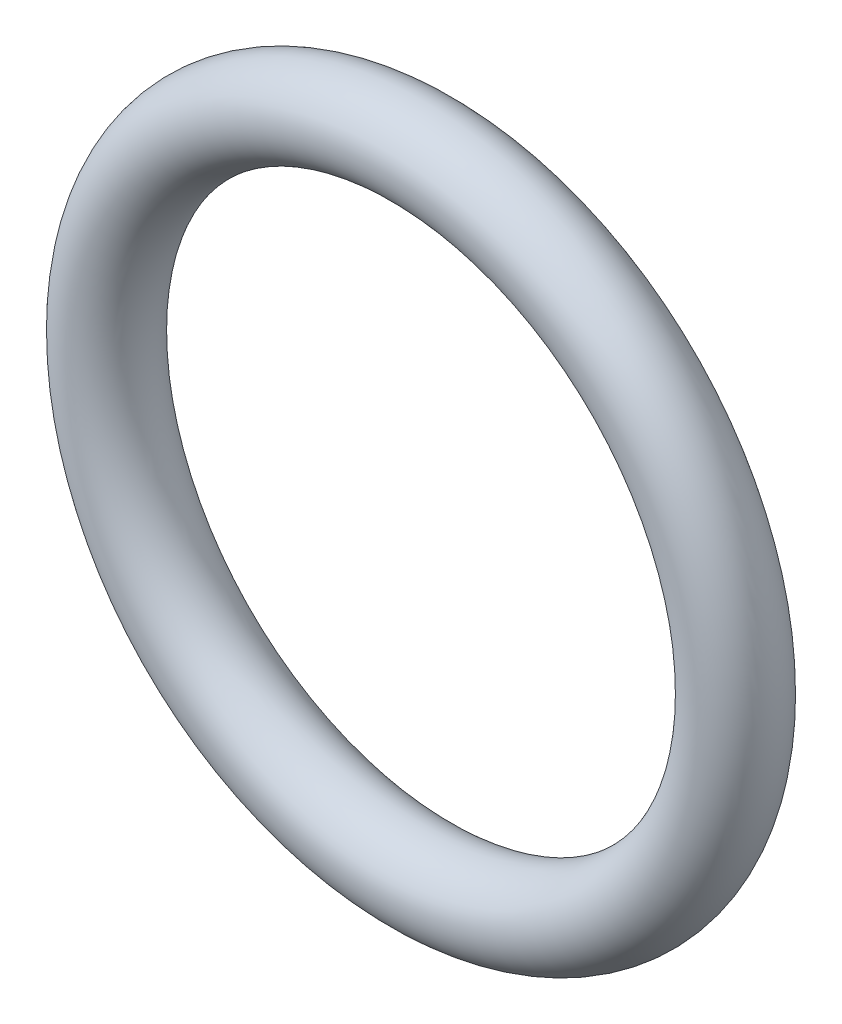
ISO-10303-21;
HEADER;
FILE_DESCRIPTION(('STEP AP214'),'2;1');
FILE_NAME('part.step','',(''),(''),'','','');
FILE_SCHEMA(('AUTOMOTIVE_DESIGN { 1 0 10303 214 1 1 1 1 }'));
ENDSEC;
DATA;
#1=APPLICATION_CONTEXT('core data for automotive mechanical design processes');
#2=APPLICATION_PROTOCOL_DEFINITION('international standard','automotive_design',2000,#1);
#3=PRODUCT_CONTEXT('',#1,'mechanical');
#4=PRODUCT('Part','Part','',(#3));
#5=PRODUCT_RELATED_PRODUCT_CATEGORY('part','',(#4));
#6=PRODUCT_DEFINITION_FORMATION('','',#4);
#7=PRODUCT_DEFINITION_CONTEXT('part definition',#1,'design');
#8=PRODUCT_DEFINITION('design','',#6,#7);
#9=PRODUCT_DEFINITION_SHAPE('','',#8);
#10=(LENGTH_UNIT() NAMED_UNIT(*) SI_UNIT(.MILLI.,.METRE.));
#11=(NAMED_UNIT(*) PLANE_ANGLE_UNIT() SI_UNIT($,.RADIAN.));
#12=(NAMED_UNIT(*) SI_UNIT($,.STERADIAN.) SOLID_ANGLE_UNIT());
#13=UNCERTAINTY_MEASURE_WITH_UNIT(LENGTH_MEASURE(1.E-05),#10,'distance_accuracy_value','');
#14=(GEOMETRIC_REPRESENTATION_CONTEXT(3) GLOBAL_UNCERTAINTY_ASSIGNED_CONTEXT((#13)) GLOBAL_UNIT_ASSIGNED_CONTEXT((#10,
#11,#12)) REPRESENTATION_CONTEXT('',''));
#15=CARTESIAN_POINT('',(0.,0.,0.));
#16=DIRECTION('',(0.,0.,1.));
#17=DIRECTION('',(1.,0.,0.));
#18=AXIS2_PLACEMENT_3D('',#15,#16,#17);
#19=CARTESIAN_POINT('',(0.,0.,0.));
#20=DIRECTION('',(0.,0.,1.));
#21=DIRECTION('',(1.,0.,0.));
#22=AXIS2_PLACEMENT_3D('',#19,#20,#21);
#23=TOROIDAL_SURFACE('',#22,9.25,1.25);
#24=CARTESIAN_POINT('',(10.5,0.,0.));
#25=VERTEX_POINT('',#24);
#26=VERTEX_LOOP('',#25);
#27=FACE_BOUND('',#26,.T.);
#28=ADVANCED_FACE('F31',(#27),#23,.T.);
#29=CLOSED_SHELL('',(#28));
#30=MANIFOLD_SOLID_BREP('B2',#29);
#31=ADVANCED_BREP_SHAPE_REPRESENTATION('',(#18,#30),#14);
#32=SHAPE_DEFINITION_REPRESENTATION(#9,#31);
ENDSEC;
END-ISO-10303-21;
